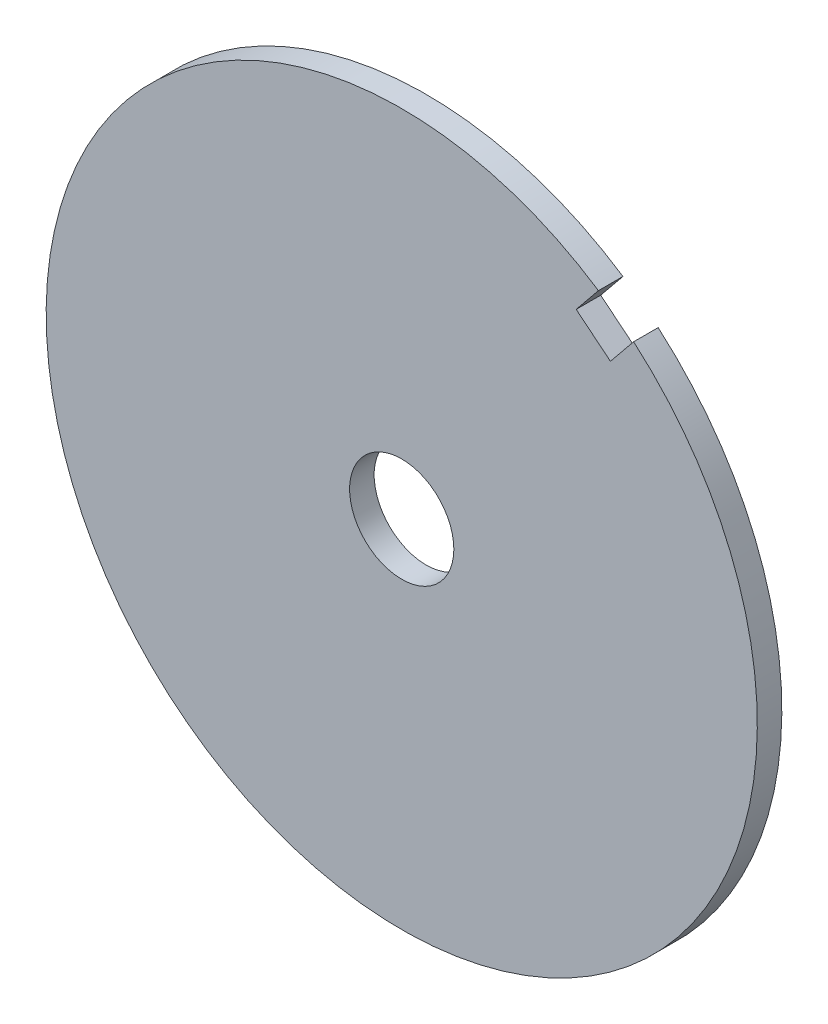
ISO-10303-21;
HEADER;
FILE_DESCRIPTION(('STEP AP214'),'2;1');
FILE_NAME('part.step','',(''),(''),'','','');
FILE_SCHEMA(('AUTOMOTIVE_DESIGN { 1 0 10303 214 1 1 1 1 }'));
ENDSEC;
DATA;
#1=APPLICATION_CONTEXT('core data for automotive mechanical design processes');
#2=APPLICATION_PROTOCOL_DEFINITION('international standard','automotive_design',2000,#1);
#3=PRODUCT_CONTEXT('',#1,'mechanical');
#4=PRODUCT('Part','Part','',(#3));
#5=PRODUCT_RELATED_PRODUCT_CATEGORY('part','',(#4));
#6=PRODUCT_DEFINITION_FORMATION('','',#4);
#7=PRODUCT_DEFINITION_CONTEXT('part definition',#1,'design');
#8=PRODUCT_DEFINITION('design','',#6,#7);
#9=PRODUCT_DEFINITION_SHAPE('','',#8);
#10=(LENGTH_UNIT() NAMED_UNIT(*) SI_UNIT(.MILLI.,.METRE.));
#11=(NAMED_UNIT(*) PLANE_ANGLE_UNIT() SI_UNIT($,.RADIAN.));
#12=(NAMED_UNIT(*) SI_UNIT($,.STERADIAN.) SOLID_ANGLE_UNIT());
#13=UNCERTAINTY_MEASURE_WITH_UNIT(LENGTH_MEASURE(1.E-05),#10,'distance_accuracy_value','');
#14=(GEOMETRIC_REPRESENTATION_CONTEXT(3) GLOBAL_UNCERTAINTY_ASSIGNED_CONTEXT((#13)) GLOBAL_UNIT_ASSIGNED_CONTEXT((#10,
#11,#12)) REPRESENTATION_CONTEXT('',''));
#15=CARTESIAN_POINT('',(0.,0.,0.));
#16=DIRECTION('',(0.,0.,1.));
#17=DIRECTION('',(1.,0.,0.));
#18=AXIS2_PLACEMENT_3D('',#15,#16,#17);
#19=CARTESIAN_POINT('',(0.,0.,3379.12779320778));
#20=DIRECTION('',(0.,0.,-1.));
#21=DIRECTION('',(-1.,0.,0.));
#22=AXIS2_PLACEMENT_3D('',#19,#20,#21);
#23=CYLINDRICAL_SURFACE('',#22,92.075);
#24=DIRECTION('',(0.,0.,-1.));
#25=VECTOR('',#24,1.);
#26=CARTESIAN_POINT('',(50.9357688696659,76.7030186802056,3704.75883321894));
#27=LINE('',#26,#25);
#28=CARTESIAN_POINT('',(50.9357688696659,76.7030186802056,3379.12779320778));
#29=VERTEX_POINT('',#28);
#30=CARTESIAN_POINT('',(50.9357688696659,76.7030186802056,3372.77779320778));
#31=VERTEX_POINT('',#30);
#32=EDGE_CURVE('E100',#29,#31,#27,.T.);
#33=ORIENTED_EDGE('',*,*,#32,.T.);
#34=CARTESIAN_POINT('',(0.,0.,3372.77779320778));
#35=DIRECTION('',(0.,0.,1.));
#36=DIRECTION('',(1.,0.,0.));
#37=AXIS2_PLACEMENT_3D('',#34,#35,#36);
#38=CIRCLE('',#37,92.075);
#39=CARTESIAN_POINT('',(60.0518838215574,69.7966824031213,3372.77779320778));
#40=VERTEX_POINT('',#39);
#41=EDGE_CURVE('E112',#31,#40,#38,.T.);
#42=ORIENTED_EDGE('',*,*,#41,.T.);
#43=DIRECTION('',(0.,0.,-1.));
#44=VECTOR('',#43,1.);
#45=CARTESIAN_POINT('',(60.0518838215574,69.7966824031213,3704.75883321894));
#46=LINE('',#45,#44);
#47=CARTESIAN_POINT('',(60.0518838215574,69.7966824031213,3379.12779320778));
#48=VERTEX_POINT('',#47);
#49=EDGE_CURVE('E91',#48,#40,#46,.T.);
#50=ORIENTED_EDGE('',*,*,#49,.F.);
#51=CARTESIAN_POINT('',(0.,0.,3379.12779320778));
#52=DIRECTION('',(0.,0.,1.));
#53=DIRECTION('',(1.,0.,0.));
#54=AXIS2_PLACEMENT_3D('',#51,#52,#53);
#55=CIRCLE('',#54,92.075);
#56=EDGE_CURVE('E92',#29,#48,#55,.T.);
#57=ORIENTED_EDGE('',*,*,#56,.F.);
#58=EDGE_LOOP('',(#33,#42,#50,#57));
#59=FACE_BOUND('',#58,.T.);
#60=ADVANCED_FACE('F39',(#59),#23,.T.);
#61=CARTESIAN_POINT('',(0.,0.,3379.12779320778));
#62=DIRECTION('',(0.,0.,1.));
#63=DIRECTION('',(1.,0.,0.));
#64=AXIS2_PLACEMENT_3D('',#61,#62,#63);
#65=PLANE('',#64);
#66=CARTESIAN_POINT('',(0.,0.,3379.12779320778));
#67=DIRECTION('',(0.,0.,1.));
#68=DIRECTION('',(1.,0.,0.));
#69=AXIS2_PLACEMENT_3D('',#66,#67,#68);
#70=CIRCLE('',#69,13.49375);
#71=CARTESIAN_POINT('',(13.49375,0.,3379.12779320778));
#72=VERTEX_POINT('',#71);
#73=EDGE_CURVE('E106',#72,#72,#70,.T.);
#74=ORIENTED_EDGE('',*,*,#73,.F.);
#75=EDGE_LOOP('',(#74));
#76=FACE_BOUND('',#75,.T.);
#77=DIRECTION('',(-0.77574502790219,0.631046473474839,0.));
#78=VECTOR('',#77,1.);
#79=CARTESIAN_POINT('',(52.0707737908379,64.0105690549791,3379.12779320778));
#80=LINE('',#79,#78);
#81=CARTESIAN_POINT('',(54.0411661617095,62.4077110123529,3379.12779320778));
#82=VERTEX_POINT('',#81);
#83=CARTESIAN_POINT('',(45.1744004927875,69.6205722041703,3379.12779320778));
#84=VERTEX_POINT('',#83);
#85=EDGE_CURVE('E53',#82,#84,#80,.T.);
#86=ORIENTED_EDGE('',*,*,#85,.T.);
#87=DIRECTION('',(0.631046473474839,0.77574502790219,0.));
#88=VECTOR('',#87,1.);
#89=CARTESIAN_POINT('',(-6.89637329805039,5.61000314919124,3379.12779320778));
#90=LINE('',#89,#88);
#91=EDGE_CURVE('E104',#84,#29,#90,.T.);
#92=ORIENTED_EDGE('',*,*,#91,.T.);
#93=ORIENTED_EDGE('',*,*,#56,.T.);
#94=DIRECTION('',(-0.631046473474837,-0.775745027902192,0.));
#95=VECTOR('',#94,1.);
#96=CARTESIAN_POINT('',(1.97039237087183,-1.6028580426263,3379.12779320778));
#97=LINE('',#96,#95);
#98=EDGE_CURVE('E58',#48,#82,#97,.T.);
#99=ORIENTED_EDGE('',*,*,#98,.T.);
#100=EDGE_LOOP('',(#86,#92,#93,#99));
#101=FACE_BOUND('',#100,.T.);
#102=ADVANCED_FACE('F121',(#76,#101),#65,.T.);
#103=CARTESIAN_POINT('',(0.,0.,3372.77779320778));
#104=DIRECTION('',(0.,0.,1.));
#105=DIRECTION('',(1.,0.,0.));
#106=AXIS2_PLACEMENT_3D('',#103,#104,#105);
#107=PLANE('',#106);
#108=CARTESIAN_POINT('',(0.,0.,3372.77779320778));
#109=DIRECTION('',(0.,0.,1.));
#110=DIRECTION('',(1.,0.,0.));
#111=AXIS2_PLACEMENT_3D('',#108,#109,#110);
#112=CIRCLE('',#111,13.49375);
#113=CARTESIAN_POINT('',(13.49375,0.,3372.77779320778));
#114=VERTEX_POINT('',#113);
#115=EDGE_CURVE('E109',#114,#114,#112,.F.);
#116=ORIENTED_EDGE('',*,*,#115,.F.);
#117=EDGE_LOOP('',(#116));
#118=FACE_BOUND('',#117,.T.);
#119=DIRECTION('',(0.631046473474839,0.77574502790219,0.));
#120=VECTOR('',#119,1.);
#121=CARTESIAN_POINT('',(-6.89637329805039,5.61000314919124,3372.77779320778));
#122=LINE('',#121,#120);
#123=CARTESIAN_POINT('',(45.1744004927875,69.6205722041703,3372.77779320778));
#124=VERTEX_POINT('',#123);
#125=EDGE_CURVE('E11',#124,#31,#122,.T.);
#126=ORIENTED_EDGE('',*,*,#125,.F.);
#127=DIRECTION('',(-0.77574502790219,0.631046473474839,0.));
#128=VECTOR('',#127,1.);
#129=CARTESIAN_POINT('',(52.0707737908379,64.0105690549791,3372.77779320778));
#130=LINE('',#129,#128);
#131=CARTESIAN_POINT('',(54.0411661617096,62.4077110123529,3372.77779320778));
#132=VERTEX_POINT('',#131);
#133=EDGE_CURVE('E46',#132,#124,#130,.T.);
#134=ORIENTED_EDGE('',*,*,#133,.F.);
#135=DIRECTION('',(-0.631046473474837,-0.775745027902192,0.));
#136=VECTOR('',#135,1.);
#137=CARTESIAN_POINT('',(1.97039237087183,-1.6028580426263,3372.77779320778));
#138=LINE('',#137,#136);
#139=EDGE_CURVE('E80',#40,#132,#138,.T.);
#140=ORIENTED_EDGE('',*,*,#139,.F.);
#141=ORIENTED_EDGE('',*,*,#41,.F.);
#142=EDGE_LOOP('',(#126,#134,#140,#141));
#143=FACE_BOUND('',#142,.T.);
#144=ADVANCED_FACE('F78',(#118,#143),#107,.F.);
#145=CARTESIAN_POINT('',(0.,0.,3372.77679320778));
#146=DIRECTION('',(0.,0.,1.));
#147=DIRECTION('',(1.,0.,0.));
#148=AXIS2_PLACEMENT_3D('',#145,#146,#147);
#149=CYLINDRICAL_SURFACE('',#148,13.49375);
#150=CARTESIAN_POINT('',(13.49375,0.,3379.12779320778));
#151=CARTESIAN_POINT('',(13.49375,0.,3379.06164737445));
#152=CARTESIAN_POINT('',(13.49375,0.,3378.99550154111));
#153=CARTESIAN_POINT('',(13.49375,0.,3378.86320987445));
#154=CARTESIAN_POINT('',(13.49375,0.,3378.79706404111));
#155=CARTESIAN_POINT('',(13.49375,0.,3378.66477237445));
#156=CARTESIAN_POINT('',(13.49375,0.,3378.59862654111));
#157=CARTESIAN_POINT('',(13.49375,0.,3378.46633487445));
#158=CARTESIAN_POINT('',(13.49375,0.,3378.40018904112));
#159=CARTESIAN_POINT('',(13.49375,0.,3378.26789737445));
#160=CARTESIAN_POINT('',(13.49375,0.,3378.20175154111));
#161=CARTESIAN_POINT('',(13.49375,0.,3378.06945987445));
#162=CARTESIAN_POINT('',(13.49375,0.,3378.00331404112));
#163=CARTESIAN_POINT('',(13.49375,0.,3377.87102237445));
#164=CARTESIAN_POINT('',(13.49375,0.,3377.80487654111));
#165=CARTESIAN_POINT('',(13.49375,0.,3377.67258487445));
#166=CARTESIAN_POINT('',(13.49375,0.,3377.60643904111));
#167=CARTESIAN_POINT('',(13.49375,0.,3377.47414737445));
#168=CARTESIAN_POINT('',(13.49375,0.,3377.40800154111));
#169=CARTESIAN_POINT('',(13.49375,0.,3377.27570987445));
#170=CARTESIAN_POINT('',(13.49375,0.,3377.20956404111));
#171=CARTESIAN_POINT('',(13.49375,0.,3377.07727237445));
#172=CARTESIAN_POINT('',(13.49375,0.,3377.01112654112));
#173=CARTESIAN_POINT('',(13.49375,0.,3376.87883487445));
#174=CARTESIAN_POINT('',(13.49375,0.,3376.81268904111));
#175=CARTESIAN_POINT('',(13.49375,0.,3376.68039737445));
#176=CARTESIAN_POINT('',(13.49375,0.,3376.61425154111));
#177=CARTESIAN_POINT('',(13.49375,0.,3376.48195987445));
#178=CARTESIAN_POINT('',(13.49375,0.,3376.41581404111));
#179=CARTESIAN_POINT('',(13.49375,0.,3376.28352237445));
#180=CARTESIAN_POINT('',(13.49375,0.,3376.21737654111));
#181=CARTESIAN_POINT('',(13.49375,0.,3376.08508487445));
#182=CARTESIAN_POINT('',(13.49375,0.,3376.01893904111));
#183=CARTESIAN_POINT('',(13.49375,0.,3375.88664737445));
#184=CARTESIAN_POINT('',(13.49375,0.,3375.82050154111));
#185=CARTESIAN_POINT('',(13.49375,0.,3375.68820987445));
#186=CARTESIAN_POINT('',(13.49375,0.,3375.62206404111));
#187=CARTESIAN_POINT('',(13.49375,0.,3375.48977237445));
#188=CARTESIAN_POINT('',(13.49375,0.,3375.42362654112));
#189=CARTESIAN_POINT('',(13.49375,0.,3375.29133487445));
#190=CARTESIAN_POINT('',(13.49375,0.,3375.22518904111));
#191=CARTESIAN_POINT('',(13.49375,0.,3375.09289737445));
#192=CARTESIAN_POINT('',(13.49375,0.,3375.02675154111));
#193=CARTESIAN_POINT('',(13.49375,0.,3374.89445987445));
#194=CARTESIAN_POINT('',(13.49375,0.,3374.82831404111));
#195=CARTESIAN_POINT('',(13.49375,0.,3374.69602237445));
#196=CARTESIAN_POINT('',(13.49375,0.,3374.62987654111));
#197=CARTESIAN_POINT('',(13.49375,0.,3374.49758487445));
#198=CARTESIAN_POINT('',(13.49375,0.,3374.43143904112));
#199=CARTESIAN_POINT('',(13.49375,0.,3374.29914737445));
#200=CARTESIAN_POINT('',(13.49375,0.,3374.23300154111));
#201=CARTESIAN_POINT('',(13.49375,0.,3374.10070987445));
#202=CARTESIAN_POINT('',(13.49375,0.,3374.03456404111));
#203=CARTESIAN_POINT('',(13.49375,0.,3373.90227237445));
#204=CARTESIAN_POINT('',(13.49375,0.,3373.83612654111));
#205=CARTESIAN_POINT('',(13.49375,0.,3373.70383487445));
#206=CARTESIAN_POINT('',(13.49375,0.,3373.63768904111));
#207=CARTESIAN_POINT('',(13.49375,0.,3373.50539737445));
#208=CARTESIAN_POINT('',(13.49375,0.,3373.43925154112));
#209=CARTESIAN_POINT('',(13.49375,0.,3373.30695987445));
#210=CARTESIAN_POINT('',(13.49375,0.,3373.24081404111));
#211=CARTESIAN_POINT('',(13.49375,0.,3373.10852237445));
#212=CARTESIAN_POINT('',(13.49375,0.,3373.04237654112));
#213=CARTESIAN_POINT('',(13.49375,0.,3372.91008487445));
#214=CARTESIAN_POINT('',(13.49375,0.,3372.84393904111));
#215=CARTESIAN_POINT('',(13.49375,0.,3372.77779320778));
#216=B_SPLINE_CURVE_WITH_KNOTS('',3,(#150,#151,#152,#153,#154,#155,#156,#157,#158,#159,#160,
#161,#162,#163,#164,#165,#166,#167,#168,#169,#170,#171,#172,#173,#174,#175,#176,#177,#178,#179,
#180,#181,#182,#183,#184,#185,#186,#187,#188,#189,#190,#191,#192,#193,#194,#195,#196,#197,#198,
#199,#200,#201,#202,#203,#204,#205,#206,#207,#208,#209,#210,#211,#212,#213,#214,#215),
.UNSPECIFIED.,.F.,.F.,(4,2,2,2,2,2,2,2,2,2,2,2,2,2,2,2,2,2,2,2,2,2,2,2,2,2,2,2,2,2,2,2,4),(0.,
0.198437499999926,0.396874999999852,0.595312499999778,0.793749999999704,0.992187499999631,
1.19062499999956,1.38906249999993,1.58749999999985,1.78593749999978,1.98437499999971,
2.18281249999963,2.38124999999956,2.57968749999993,2.77812499999985,2.97656249999978,
3.17499999999971,3.37343749999963,3.57187499999956,3.77031249999948,3.96874999999985,
4.16718749999978,4.36562499999971,4.56406249999963,4.76249999999956,4.96093749999948,
5.15937499999986,5.35781249999978,5.55624999999971,5.75468749999963,5.95312499999956,
6.15156249999949,6.34999999999986),.UNSPECIFIED.);
#217=EDGE_CURVE('BSEAM129',#72,#114,#216,.T.);
#218=ORIENTED_EDGE('',*,*,#73,.T.);
#219=ORIENTED_EDGE('',*,*,#115,.T.);
#220=ORIENTED_EDGE('',*,*,#217,.T.);
#221=ORIENTED_EDGE('',*,*,#217,.F.);
#222=EDGE_LOOP('',(#218,#220,#219,#221));
#223=FACE_BOUND('',#222,.T.);
#224=ADVANCED_FACE('F129',(#223),#149,.F.);
#225=CARTESIAN_POINT('',(50.9357688696659,76.7030186802056,3704.75883321894));
#226=DIRECTION('',(0.77574502790219,-0.631046473474839,0.));
#227=DIRECTION('',(0.631046473474839,0.77574502790219,0.));
#228=AXIS2_PLACEMENT_3D('',#225,#226,#227);
#229=PLANE('',#228);
#230=ORIENTED_EDGE('',*,*,#91,.F.);
#231=DIRECTION('',(0.,0.,-1.));
#232=VECTOR('',#231,1.);
#233=CARTESIAN_POINT('',(45.1744004927875,69.6205722041703,3704.75883321894));
#234=LINE('',#233,#232);
#235=EDGE_CURVE('E96',#84,#124,#234,.T.);
#236=ORIENTED_EDGE('',*,*,#235,.T.);
#237=ORIENTED_EDGE('',*,*,#125,.T.);
#238=ORIENTED_EDGE('',*,*,#32,.F.);
#239=EDGE_LOOP('',(#230,#236,#237,#238));
#240=FACE_BOUND('',#239,.T.);
#241=ADVANCED_FACE('F120',(#240),#229,.T.);
#242=CARTESIAN_POINT('',(45.1744004927875,69.6205722041703,3704.75883321894));
#243=DIRECTION('',(0.631046473474839,0.77574502790219,0.));
#244=DIRECTION('',(-0.77574502790219,0.631046473474839,0.));
#245=AXIS2_PLACEMENT_3D('',#242,#243,#244);
#246=PLANE('',#245);
#247=ORIENTED_EDGE('',*,*,#85,.F.);
#248=DIRECTION('',(0.,0.,-1.));
#249=VECTOR('',#248,1.);
#250=CARTESIAN_POINT('',(54.0411661617096,62.4077110123529,3704.75883321894));
#251=LINE('',#250,#249);
#252=EDGE_CURVE('E90',#82,#132,#251,.T.);
#253=ORIENTED_EDGE('',*,*,#252,.T.);
#254=ORIENTED_EDGE('',*,*,#133,.T.);
#255=ORIENTED_EDGE('',*,*,#235,.F.);
#256=EDGE_LOOP('',(#247,#253,#254,#255));
#257=FACE_BOUND('',#256,.T.);
#258=ADVANCED_FACE('F94',(#257),#246,.T.);
#259=CARTESIAN_POINT('',(54.0411661617096,62.4077110123529,3704.75883321894));
#260=DIRECTION('',(-0.775745027902192,0.631046473474837,0.));
#261=DIRECTION('',(-0.631046473474837,-0.775745027902192,0.));
#262=AXIS2_PLACEMENT_3D('',#259,#260,#261);
#263=PLANE('',#262);
#264=ORIENTED_EDGE('',*,*,#98,.F.);
#265=ORIENTED_EDGE('',*,*,#49,.T.);
#266=ORIENTED_EDGE('',*,*,#139,.T.);
#267=ORIENTED_EDGE('',*,*,#252,.F.);
#268=EDGE_LOOP('',(#264,#265,#266,#267));
#269=FACE_BOUND('',#268,.T.);
#270=ADVANCED_FACE('F89',(#269),#263,.T.);
#271=CLOSED_SHELL('',(#60,#102,#144,#224,#241,#258,#270));
#272=MANIFOLD_SOLID_BREP('B2',#271);
#273=ADVANCED_BREP_SHAPE_REPRESENTATION('',(#18,#272),#14);
#274=SHAPE_DEFINITION_REPRESENTATION(#9,#273);
ENDSEC;
END-ISO-10303-21;
